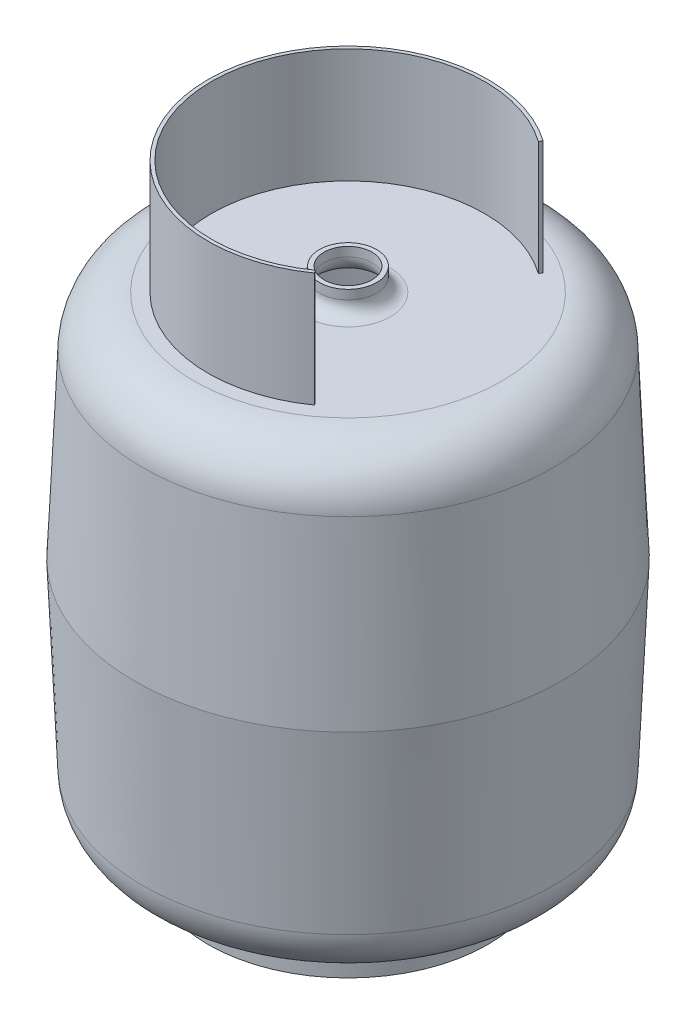
ISO-10303-21;
HEADER;
FILE_DESCRIPTION(('STEP AP214'),'2;1');
FILE_NAME('part.step','',(''),(''),'','','');
FILE_SCHEMA(('AUTOMOTIVE_DESIGN { 1 0 10303 214 1 1 1 1 }'));
ENDSEC;
DATA;
#1=APPLICATION_CONTEXT('core data for automotive mechanical design processes');
#2=APPLICATION_PROTOCOL_DEFINITION('international standard','automotive_design',2000,#1);
#3=PRODUCT_CONTEXT('',#1,'mechanical');
#4=PRODUCT('Part','Part','',(#3));
#5=PRODUCT_RELATED_PRODUCT_CATEGORY('part','',(#4));
#6=PRODUCT_DEFINITION_FORMATION('','',#4);
#7=PRODUCT_DEFINITION_CONTEXT('part definition',#1,'design');
#8=PRODUCT_DEFINITION('design','',#6,#7);
#9=PRODUCT_DEFINITION_SHAPE('','',#8);
#10=(LENGTH_UNIT() NAMED_UNIT(*) SI_UNIT(.MILLI.,.METRE.));
#11=(NAMED_UNIT(*) PLANE_ANGLE_UNIT() SI_UNIT($,.RADIAN.));
#12=(NAMED_UNIT(*) SI_UNIT($,.STERADIAN.) SOLID_ANGLE_UNIT());
#13=UNCERTAINTY_MEASURE_WITH_UNIT(LENGTH_MEASURE(1.E-05),#10,'distance_accuracy_value','');
#14=(GEOMETRIC_REPRESENTATION_CONTEXT(3) GLOBAL_UNCERTAINTY_ASSIGNED_CONTEXT((#13)) GLOBAL_UNIT_ASSIGNED_CONTEXT((#10,
#11,#12)) REPRESENTATION_CONTEXT('',''));
#15=CARTESIAN_POINT('',(0.,0.,0.));
#16=DIRECTION('',(0.,0.,1.));
#17=DIRECTION('',(1.,0.,0.));
#18=AXIS2_PLACEMENT_3D('',#15,#16,#17);
#19=CARTESIAN_POINT('',(134.421871598533,0.,0.));
#20=DIRECTION('',(0.,-1.,0.));
#21=DIRECTION('',(1.,0.,0.));
#22=AXIS2_PLACEMENT_3D('',#19,#20,#21);
#23=PLANE('',#22);
#24=CARTESIAN_POINT('',(0.,0.,0.));
#25=DIRECTION('',(0.,1.,0.));
#26=DIRECTION('',(-1.,0.,0.));
#27=AXIS2_PLACEMENT_3D('',#24,#25,#26);
#28=CIRCLE('',#27,134.421871598533);
#29=CARTESIAN_POINT('',(-134.421871598533,0.,0.));
#30=VERTEX_POINT('',#29);
#31=EDGE_CURVE('E137',#30,#30,#28,.T.);
#32=ORIENTED_EDGE('',*,*,#31,.T.);
#33=EDGE_LOOP('',(#32));
#34=FACE_BOUND('',#33,.T.);
#35=CARTESIAN_POINT('',(0.,0.,0.));
#36=DIRECTION('',(0.,1.,0.));
#37=DIRECTION('',(-1.,0.,0.));
#38=AXIS2_PLACEMENT_3D('',#35,#36,#37);
#39=CIRCLE('',#38,37.0000000000001);
#40=CARTESIAN_POINT('',(-37.0000000000001,0.,0.));
#41=VERTEX_POINT('',#40);
#42=EDGE_CURVE('E134',#41,#41,#39,.T.);
#43=ORIENTED_EDGE('',*,*,#42,.F.);
#44=EDGE_LOOP('',(#43));
#45=FACE_BOUND('',#44,.T.);
#46=CARTESIAN_POINT('',(0.,0.,0.));
#47=DIRECTION('',(0.,1.,0.));
#48=DIRECTION('',(-1.,0.,0.));
#49=AXIS2_PLACEMENT_3D('',#46,#47,#48);
#50=CIRCLE('',#49,122.421871598533);
#51=CARTESIAN_POINT('',(70.6195061274698,0.,-100.));
#52=VERTEX_POINT('',#51);
#53=CARTESIAN_POINT('',(70.6195061274698,0.,100.));
#54=VERTEX_POINT('',#53);
#55=EDGE_CURVE('E98',#52,#54,#50,.T.);
#56=ORIENTED_EDGE('',*,*,#55,.F.);
#57=DIRECTION('',(0.576853671695672,0.,-0.816847501955672));
#58=VECTOR('',#57,1.);
#59=CARTESIAN_POINT('',(68.8889451123828,0.,-97.549457494133));
#60=LINE('',#59,#58);
#61=CARTESIAN_POINT('',(68.8889451123828,0.,-97.549457494133));
#62=VERTEX_POINT('',#61);
#63=EDGE_CURVE('E95',#62,#52,#60,.T.);
#64=ORIENTED_EDGE('',*,*,#63,.F.);
#65=CARTESIAN_POINT('',(0.,0.,0.));
#66=DIRECTION('',(0.,-1.,0.));
#67=DIRECTION('',(-1.,0.,0.));
#68=AXIS2_PLACEMENT_3D('',#65,#66,#67);
#69=CIRCLE('',#68,119.421871598533);
#70=CARTESIAN_POINT('',(68.8889451123829,0.,97.5494574941329));
#71=VERTEX_POINT('',#70);
#72=EDGE_CURVE('E57',#71,#62,#69,.T.);
#73=ORIENTED_EDGE('',*,*,#72,.F.);
#74=DIRECTION('',(-0.576853671695667,0.,-0.816847501955676));
#75=VECTOR('',#74,1.);
#76=CARTESIAN_POINT('',(68.8889451123828,0.,97.549457494133));
#77=LINE('',#76,#75);
#78=EDGE_CURVE('E52',#54,#71,#77,.T.);
#79=ORIENTED_EDGE('',*,*,#78,.F.);
#80=EDGE_LOOP('',(#56,#64,#73,#79));
#81=FACE_BOUND('',#80,.T.);
#82=ADVANCED_FACE('F37',(#34,#45,#81),#23,.F.);
#83=CARTESIAN_POINT('',(25.,20.,0.));
#84=DIRECTION('',(0.,-1.,0.));
#85=DIRECTION('',(1.,0.,0.));
#86=AXIS2_PLACEMENT_3D('',#83,#84,#85);
#87=PLANE('',#86);
#88=CARTESIAN_POINT('',(0.,20.,0.));
#89=DIRECTION('',(0.,-1.,0.));
#90=DIRECTION('',(1.,0.,0.));
#91=AXIS2_PLACEMENT_3D('',#88,#89,#90);
#92=CIRCLE('',#91,21.);
#93=CARTESIAN_POINT('',(21.,20.,0.));
#94=VERTEX_POINT('',#93);
#95=EDGE_CURVE('E99',#94,#94,#92,.F.);
#96=ORIENTED_EDGE('',*,*,#95,.F.);
#97=EDGE_LOOP('',(#96));
#98=FACE_BOUND('',#97,.T.);
#99=CARTESIAN_POINT('',(0.,20.,0.));
#100=DIRECTION('',(0.,1.,0.));
#101=DIRECTION('',(-1.,0.,0.));
#102=AXIS2_PLACEMENT_3D('',#99,#100,#101);
#103=CIRCLE('',#102,25.);
#104=CARTESIAN_POINT('',(-25.,20.,0.));
#105=VERTEX_POINT('',#104);
#106=EDGE_CURVE('E111',#105,#105,#103,.T.);
#107=ORIENTED_EDGE('',*,*,#106,.T.);
#108=EDGE_LOOP('',(#107));
#109=FACE_BOUND('',#108,.T.);
#110=ADVANCED_FACE('F39',(#98,#109),#87,.F.);
#111=CARTESIAN_POINT('',(0.,-402.5,0.));
#112=DIRECTION('',(0.,1.,0.));
#113=DIRECTION('',(-1.,0.,0.));
#114=AXIS2_PLACEMENT_3D('',#111,#112,#113);
#115=PLANE('',#114);
#116=CARTESIAN_POINT('',(0.,-402.5,0.));
#117=DIRECTION('',(0.,1.,0.));
#118=DIRECTION('',(-1.,0.,0.));
#119=AXIS2_PLACEMENT_3D('',#116,#117,#118);
#120=CIRCLE('',#119,122.421871598533);
#121=CARTESIAN_POINT('',(-122.421871598533,-402.5,0.));
#122=VERTEX_POINT('',#121);
#123=EDGE_CURVE('E11',#122,#122,#120,.F.);
#124=ORIENTED_EDGE('',*,*,#123,.F.);
#125=EDGE_LOOP('',(#124));
#126=FACE_BOUND('',#125,.T.);
#127=CARTESIAN_POINT('',(0.,-402.5,0.));
#128=DIRECTION('',(0.,1.,0.));
#129=DIRECTION('',(-1.,0.,0.));
#130=AXIS2_PLACEMENT_3D('',#127,#128,#129);
#131=CIRCLE('',#130,134.421871598533);
#132=CARTESIAN_POINT('',(-134.421871598533,-402.5,0.));
#133=VERTEX_POINT('',#132);
#134=EDGE_CURVE('E45',#133,#133,#131,.T.);
#135=ORIENTED_EDGE('',*,*,#134,.F.);
#136=EDGE_LOOP('',(#135));
#137=FACE_BOUND('',#136,.T.);
#138=ADVANCED_FACE('F153',(#126,#137),#115,.F.);
#139=CARTESIAN_POINT('',(0.,-357.5,0.));
#140=DIRECTION('',(0.,1.,0.));
#141=DIRECTION('',(-1.,0.,0.));
#142=AXIS2_PLACEMENT_3D('',#139,#140,#141);
#143=TOROIDAL_SURFACE('',#142,134.421871598533,45.);
#144=CARTESIAN_POINT('',(0.,-359.46287243144,0.));
#145=DIRECTION('',(0.,1.,0.));
#146=DIRECTION('',(-1.,0.,0.));
#147=AXIS2_PLACEMENT_3D('',#144,#145,#146);
#148=CIRCLE('',#147,179.379041569717);
#149=CARTESIAN_POINT('',(-179.379041569717,-359.46287243144,0.));
#150=VERTEX_POINT('',#149);
#151=EDGE_CURVE('E146',#150,#150,#148,.T.);
#152=ORIENTED_EDGE('',*,*,#151,.F.);
#153=EDGE_LOOP('',(#152));
#154=FACE_BOUND('',#153,.T.);
#155=ORIENTED_EDGE('',*,*,#134,.T.);
#156=EDGE_LOOP('',(#155));
#157=FACE_BOUND('',#156,.T.);
#158=ADVANCED_FACE('F151',(#154,#157),#143,.T.);
#159=CARTESIAN_POINT('',(0.,-359.46287243144,0.));
#160=DIRECTION('',(0.,1.,0.));
#161=DIRECTION('',(-1.,0.,0.));
#162=AXIS2_PLACEMENT_3D('',#159,#160,#161);
#163=CONICAL_SURFACE('',#162,179.379041569717,0.0436332312998548);
#164=CARTESIAN_POINT('',(0.,-201.25,0.));
#165=DIRECTION('',(0.,1.,0.));
#166=DIRECTION('',(-1.,0.,0.));
#167=AXIS2_PLACEMENT_3D('',#164,#165,#166);
#168=CIRCLE('',#167,186.286764760337);
#169=CARTESIAN_POINT('',(-186.286764760337,-201.25,0.));
#170=VERTEX_POINT('',#169);
#171=EDGE_CURVE('E143',#170,#170,#168,.T.);
#172=ORIENTED_EDGE('',*,*,#171,.F.);
#173=EDGE_LOOP('',(#172));
#174=FACE_BOUND('',#173,.T.);
#175=ORIENTED_EDGE('',*,*,#151,.T.);
#176=EDGE_LOOP('',(#175));
#177=FACE_BOUND('',#176,.T.);
#178=ADVANCED_FACE('F161',(#174,#177),#163,.T.);
#179=CARTESIAN_POINT('',(0.,-201.25,0.));
#180=DIRECTION('',(0.,-1.,0.));
#181=DIRECTION('',(1.,0.,0.));
#182=AXIS2_PLACEMENT_3D('',#179,#180,#181);
#183=CONICAL_SURFACE('',#182,186.286764760337,0.0436332312998546);
#184=CARTESIAN_POINT('',(0.,-43.0371275685604,0.));
#185=DIRECTION('',(0.,1.,0.));
#186=DIRECTION('',(-1.,0.,0.));
#187=AXIS2_PLACEMENT_3D('',#184,#185,#186);
#188=CIRCLE('',#187,179.379041569717);
#189=CARTESIAN_POINT('',(-179.379041569717,-43.0371275685604,0.));
#190=VERTEX_POINT('',#189);
#191=EDGE_CURVE('E140',#190,#190,#188,.T.);
#192=ORIENTED_EDGE('',*,*,#191,.F.);
#193=EDGE_LOOP('',(#192));
#194=FACE_BOUND('',#193,.T.);
#195=ORIENTED_EDGE('',*,*,#171,.T.);
#196=EDGE_LOOP('',(#195));
#197=FACE_BOUND('',#196,.T.);
#198=ADVANCED_FACE('F182',(#194,#197),#183,.T.);
#199=CARTESIAN_POINT('',(0.,-45.,0.));
#200=DIRECTION('',(0.,1.,0.));
#201=DIRECTION('',(-1.,0.,0.));
#202=AXIS2_PLACEMENT_3D('',#199,#200,#201);
#203=TOROIDAL_SURFACE('',#202,134.421871598533,45.);
#204=ORIENTED_EDGE('',*,*,#31,.F.);
#205=EDGE_LOOP('',(#204));
#206=FACE_BOUND('',#205,.T.);
#207=ORIENTED_EDGE('',*,*,#191,.T.);
#208=EDGE_LOOP('',(#207));
#209=FACE_BOUND('',#208,.T.);
#210=ADVANCED_FACE('F179',(#206,#209),#203,.T.);
#211=CARTESIAN_POINT('',(0.,12.,0.));
#212=DIRECTION('',(0.,1.,0.));
#213=DIRECTION('',(-1.,0.,0.));
#214=AXIS2_PLACEMENT_3D('',#211,#212,#213);
#215=TOROIDAL_SURFACE('',#214,37.,12.);
#216=CARTESIAN_POINT('',(0.,12.,0.));
#217=DIRECTION('',(0.,1.,0.));
#218=DIRECTION('',(-1.,0.,0.));
#219=AXIS2_PLACEMENT_3D('',#216,#217,#218);
#220=CIRCLE('',#219,25.);
#221=CARTESIAN_POINT('',(-25.,12.,0.));
#222=VERTEX_POINT('',#221);
#223=EDGE_CURVE('E131',#222,#222,#220,.T.);
#224=ORIENTED_EDGE('',*,*,#223,.F.);
#225=EDGE_LOOP('',(#224));
#226=FACE_BOUND('',#225,.T.);
#227=ORIENTED_EDGE('',*,*,#42,.T.);
#228=EDGE_LOOP('',(#227));
#229=FACE_BOUND('',#228,.T.);
#230=ADVANCED_FACE('F177',(#226,#229),#215,.F.);
#231=CARTESIAN_POINT('',(0.,0.,0.));
#232=DIRECTION('',(0.,1.,0.));
#233=DIRECTION('',(-1.,0.,0.));
#234=AXIS2_PLACEMENT_3D('',#231,#232,#233);
#235=CYLINDRICAL_SURFACE('',#234,25.);
#236=ORIENTED_EDGE('',*,*,#106,.F.);
#237=EDGE_LOOP('',(#236));
#238=FACE_BOUND('',#237,.T.);
#239=ORIENTED_EDGE('',*,*,#223,.T.);
#240=EDGE_LOOP('',(#239));
#241=FACE_BOUND('',#240,.T.);
#242=ADVANCED_FACE('F211',(#238,#241),#235,.T.);
#243=CARTESIAN_POINT('',(0.,-398.5,0.));
#244=DIRECTION('',(0.,1.,0.));
#245=DIRECTION('',(-1.,0.,0.));
#246=AXIS2_PLACEMENT_3D('',#243,#244,#245);
#247=PLANE('',#246);
#248=CARTESIAN_POINT('',(0.,-398.5,0.));
#249=DIRECTION('',(0.,1.,0.));
#250=DIRECTION('',(-1.,0.,0.));
#251=AXIS2_PLACEMENT_3D('',#248,#249,#250);
#252=CIRCLE('',#251,134.421871598533);
#253=CARTESIAN_POINT('',(-134.421871598533,-398.5,0.));
#254=VERTEX_POINT('',#253);
#255=EDGE_CURVE('E108',#254,#254,#252,.T.);
#256=ORIENTED_EDGE('',*,*,#255,.T.);
#257=EDGE_LOOP('',(#256));
#258=FACE_BOUND('',#257,.T.);
#259=ADVANCED_FACE('F218',(#258),#247,.T.);
#260=CARTESIAN_POINT('',(0.,-357.5,0.));
#261=DIRECTION('',(0.,1.,0.));
#262=DIRECTION('',(-1.,0.,0.));
#263=AXIS2_PLACEMENT_3D('',#260,#261,#262);
#264=TOROIDAL_SURFACE('',#263,134.421871598533,41.);
#265=CARTESIAN_POINT('',(0.,-359.288394881978,0.));
#266=DIRECTION('',(0.,1.,0.));
#267=DIRECTION('',(-1.,0.,0.));
#268=AXIS2_PLACEMENT_3D('',#265,#266,#267);
#269=CIRCLE('',#268,175.38284868339);
#270=CARTESIAN_POINT('',(-175.38284868339,-359.288394881978,0.));
#271=VERTEX_POINT('',#270);
#272=EDGE_CURVE('E112',#271,#271,#269,.T.);
#273=ORIENTED_EDGE('',*,*,#272,.T.);
#274=EDGE_LOOP('',(#273));
#275=FACE_BOUND('',#274,.T.);
#276=ORIENTED_EDGE('',*,*,#255,.F.);
#277=EDGE_LOOP('',(#276));
#278=FACE_BOUND('',#277,.T.);
#279=ADVANCED_FACE('F226',(#275,#278),#264,.F.);
#280=CARTESIAN_POINT('',(0.,-359.288394881978,0.));
#281=DIRECTION('',(0.,1.,0.));
#282=DIRECTION('',(-1.,0.,0.));
#283=AXIS2_PLACEMENT_3D('',#280,#281,#282);
#284=CONICAL_SURFACE('',#283,175.38284868339,0.0436332312998548);
#285=CARTESIAN_POINT('',(0.,-201.25,0.));
#286=DIRECTION('',(0.,1.,0.));
#287=DIRECTION('',(-1.,0.,0.));
#288=AXIS2_PLACEMENT_3D('',#285,#286,#287);
#289=CIRCLE('',#288,182.282954019684);
#290=CARTESIAN_POINT('',(-182.282954019684,-201.25,0.));
#291=VERTEX_POINT('',#290);
#292=EDGE_CURVE('E115',#291,#291,#289,.T.);
#293=ORIENTED_EDGE('',*,*,#292,.T.);
#294=EDGE_LOOP('',(#293));
#295=FACE_BOUND('',#294,.T.);
#296=ORIENTED_EDGE('',*,*,#272,.F.);
#297=EDGE_LOOP('',(#296));
#298=FACE_BOUND('',#297,.T.);
#299=ADVANCED_FACE('F234',(#295,#298),#284,.F.);
#300=CARTESIAN_POINT('',(0.,-201.424477549461,0.));
#301=DIRECTION('',(0.,-1.,0.));
#302=DIRECTION('',(1.,0.,0.));
#303=AXIS2_PLACEMENT_3D('',#300,#301,#302);
#304=CONICAL_SURFACE('',#303,182.29057187401,0.0436332312998546);
#305=CARTESIAN_POINT('',(0.,-43.2116051180217,0.));
#306=DIRECTION('',(0.,1.,0.));
#307=DIRECTION('',(-1.,0.,0.));
#308=AXIS2_PLACEMENT_3D('',#305,#306,#307);
#309=CIRCLE('',#308,175.38284868339);
#310=CARTESIAN_POINT('',(-175.38284868339,-43.2116051180217,0.));
#311=VERTEX_POINT('',#310);
#312=EDGE_CURVE('E118',#311,#311,#309,.T.);
#313=ORIENTED_EDGE('',*,*,#312,.T.);
#314=EDGE_LOOP('',(#313));
#315=FACE_BOUND('',#314,.T.);
#316=ORIENTED_EDGE('',*,*,#292,.F.);
#317=EDGE_LOOP('',(#316));
#318=FACE_BOUND('',#317,.T.);
#319=ADVANCED_FACE('F242',(#315,#318),#304,.F.);
#320=CARTESIAN_POINT('',(0.,-45.,0.));
#321=DIRECTION('',(0.,1.,0.));
#322=DIRECTION('',(-1.,0.,0.));
#323=AXIS2_PLACEMENT_3D('',#320,#321,#322);
#324=TOROIDAL_SURFACE('',#323,134.421871598533,41.);
#325=CARTESIAN_POINT('',(0.,-4.00000000000002,0.));
#326=DIRECTION('',(0.,1.,0.));
#327=DIRECTION('',(-1.,0.,0.));
#328=AXIS2_PLACEMENT_3D('',#325,#326,#327);
#329=CIRCLE('',#328,134.421871598533);
#330=CARTESIAN_POINT('',(-134.421871598533,-4.00000000000003,0.));
#331=VERTEX_POINT('',#330);
#332=EDGE_CURVE('E121',#331,#331,#329,.T.);
#333=ORIENTED_EDGE('',*,*,#332,.T.);
#334=EDGE_LOOP('',(#333));
#335=FACE_BOUND('',#334,.T.);
#336=ORIENTED_EDGE('',*,*,#312,.F.);
#337=EDGE_LOOP('',(#336));
#338=FACE_BOUND('',#337,.T.);
#339=ADVANCED_FACE('F250',(#335,#338),#324,.F.);
#340=CARTESIAN_POINT('',(134.421871598533,-4.00000000000001,0.));
#341=DIRECTION('',(0.,-1.,0.));
#342=DIRECTION('',(1.,0.,0.));
#343=AXIS2_PLACEMENT_3D('',#340,#341,#342);
#344=PLANE('',#343);
#345=CARTESIAN_POINT('',(0.,-4.00000000000002,0.));
#346=DIRECTION('',(0.,1.,0.));
#347=DIRECTION('',(-1.,0.,0.));
#348=AXIS2_PLACEMENT_3D('',#345,#346,#347);
#349=CIRCLE('',#348,37.0000000000001);
#350=CARTESIAN_POINT('',(-37.0000000000001,-4.00000000000003,0.));
#351=VERTEX_POINT('',#350);
#352=EDGE_CURVE('E124',#351,#351,#349,.T.);
#353=ORIENTED_EDGE('',*,*,#352,.T.);
#354=EDGE_LOOP('',(#353));
#355=FACE_BOUND('',#354,.T.);
#356=ORIENTED_EDGE('',*,*,#332,.F.);
#357=EDGE_LOOP('',(#356));
#358=FACE_BOUND('',#357,.T.);
#359=ADVANCED_FACE('F258',(#355,#358),#344,.T.);
#360=CARTESIAN_POINT('',(0.,12.,0.));
#361=DIRECTION('',(0.,1.,0.));
#362=DIRECTION('',(-1.,0.,0.));
#363=AXIS2_PLACEMENT_3D('',#360,#361,#362);
#364=TOROIDAL_SURFACE('',#363,37.,16.);
#365=CARTESIAN_POINT('',(0.,12.,0.));
#366=DIRECTION('',(0.,1.,0.));
#367=DIRECTION('',(-1.,0.,0.));
#368=AXIS2_PLACEMENT_3D('',#365,#366,#367);
#369=CIRCLE('',#368,21.);
#370=CARTESIAN_POINT('',(-21.,12.,0.));
#371=VERTEX_POINT('',#370);
#372=EDGE_CURVE('E102',#371,#371,#369,.T.);
#373=ORIENTED_EDGE('',*,*,#372,.T.);
#374=EDGE_LOOP('',(#373));
#375=FACE_BOUND('',#374,.T.);
#376=ORIENTED_EDGE('',*,*,#352,.F.);
#377=EDGE_LOOP('',(#376));
#378=FACE_BOUND('',#377,.T.);
#379=ADVANCED_FACE('F266',(#375,#378),#364,.T.);
#380=CARTESIAN_POINT('',(0.,0.,0.));
#381=DIRECTION('',(0.,1.,0.));
#382=DIRECTION('',(-1.,0.,0.));
#383=AXIS2_PLACEMENT_3D('',#380,#381,#382);
#384=CYLINDRICAL_SURFACE('',#383,21.);
#385=ORIENTED_EDGE('',*,*,#95,.T.);
#386=EDGE_LOOP('',(#385));
#387=FACE_BOUND('',#386,.T.);
#388=ORIENTED_EDGE('',*,*,#372,.F.);
#389=EDGE_LOOP('',(#388));
#390=FACE_BOUND('',#389,.T.);
#391=ADVANCED_FACE('F274',(#387,#390),#384,.F.);
#392=CARTESIAN_POINT('',(0.,100.,0.));
#393=DIRECTION('',(0.,-1.,0.));
#394=DIRECTION('',(1.,0.,0.));
#395=AXIS2_PLACEMENT_3D('',#392,#393,#394);
#396=CYLINDRICAL_SURFACE('',#395,122.421871598533);
#397=ORIENTED_EDGE('',*,*,#55,.T.);
#398=DIRECTION('',(0.,-1.,0.));
#399=VECTOR('',#398,1.);
#400=CARTESIAN_POINT('',(70.6195061274698,100.,100.));
#401=LINE('',#400,#399);
#402=CARTESIAN_POINT('',(70.6195061274698,100.,100.));
#403=VERTEX_POINT('',#402);
#404=EDGE_CURVE('E79',#403,#54,#401,.T.);
#405=ORIENTED_EDGE('',*,*,#404,.F.);
#406=CARTESIAN_POINT('',(0.,100.,0.));
#407=DIRECTION('',(0.,1.,0.));
#408=DIRECTION('',(-1.,0.,0.));
#409=AXIS2_PLACEMENT_3D('',#406,#407,#408);
#410=CIRCLE('',#409,122.421871598533);
#411=CARTESIAN_POINT('',(70.6195061274698,100.,-100.));
#412=VERTEX_POINT('',#411);
#413=EDGE_CURVE('E86',#412,#403,#410,.T.);
#414=ORIENTED_EDGE('',*,*,#413,.F.);
#415=DIRECTION('',(0.,-1.,0.));
#416=VECTOR('',#415,1.);
#417=CARTESIAN_POINT('',(70.6195061274698,100.,-100.));
#418=LINE('',#417,#416);
#419=EDGE_CURVE('E422',#412,#52,#418,.T.);
#420=ORIENTED_EDGE('',*,*,#419,.T.);
#421=EDGE_LOOP('',(#397,#405,#414,#420));
#422=FACE_BOUND('',#421,.T.);
#423=ADVANCED_FACE('F97',(#422),#396,.T.);
#424=CARTESIAN_POINT('',(68.8889451123828,100.,97.549457494133));
#425=DIRECTION('',(-0.816847501955676,0.,0.576853671695667));
#426=DIRECTION('',(0.576853671695667,0.,0.816847501955676));
#427=AXIS2_PLACEMENT_3D('',#424,#425,#426);
#428=PLANE('',#427);
#429=ORIENTED_EDGE('',*,*,#78,.T.);
#430=DIRECTION('',(0.,-1.,0.));
#431=VECTOR('',#430,1.);
#432=CARTESIAN_POINT('',(68.8889451123828,100.,97.5494574941329));
#433=LINE('',#432,#431);
#434=CARTESIAN_POINT('',(68.8889451123828,100.,97.5494574941329));
#435=VERTEX_POINT('',#434);
#436=EDGE_CURVE('E82',#435,#71,#433,.T.);
#437=ORIENTED_EDGE('',*,*,#436,.F.);
#438=DIRECTION('',(-0.576853671695667,0.,-0.816847501955676));
#439=VECTOR('',#438,1.);
#440=CARTESIAN_POINT('',(68.8889451123828,100.,97.549457494133));
#441=LINE('',#440,#439);
#442=EDGE_CURVE('E75',#403,#435,#441,.T.);
#443=ORIENTED_EDGE('',*,*,#442,.F.);
#444=ORIENTED_EDGE('',*,*,#404,.T.);
#445=EDGE_LOOP('',(#429,#437,#443,#444));
#446=FACE_BOUND('',#445,.T.);
#447=ADVANCED_FACE('F77',(#446),#428,.F.);
#448=CARTESIAN_POINT('',(0.,100.,0.));
#449=DIRECTION('',(0.,-1.,0.));
#450=DIRECTION('',(1.,0.,0.));
#451=AXIS2_PLACEMENT_3D('',#448,#449,#450);
#452=CYLINDRICAL_SURFACE('',#451,119.421871598533);
#453=ORIENTED_EDGE('',*,*,#72,.T.);
#454=DIRECTION('',(0.,-1.,0.));
#455=VECTOR('',#454,1.);
#456=CARTESIAN_POINT('',(68.8889451123827,100.,-97.549457494133));
#457=LINE('',#456,#455);
#458=CARTESIAN_POINT('',(68.8889451123827,100.,-97.549457494133));
#459=VERTEX_POINT('',#458);
#460=EDGE_CURVE('E104',#459,#62,#457,.T.);
#461=ORIENTED_EDGE('',*,*,#460,.F.);
#462=CARTESIAN_POINT('',(0.,100.,0.));
#463=DIRECTION('',(0.,-1.,0.));
#464=DIRECTION('',(-1.,0.,0.));
#465=AXIS2_PLACEMENT_3D('',#462,#463,#464);
#466=CIRCLE('',#465,119.421871598533);
#467=EDGE_CURVE('E85',#435,#459,#466,.T.);
#468=ORIENTED_EDGE('',*,*,#467,.F.);
#469=ORIENTED_EDGE('',*,*,#436,.T.);
#470=EDGE_LOOP('',(#453,#461,#468,#469));
#471=FACE_BOUND('',#470,.T.);
#472=ADVANCED_FACE('F295',(#471),#452,.F.);
#473=CARTESIAN_POINT('',(68.8889451123827,100.,-97.549457494133));
#474=DIRECTION('',(-0.816847501955672,0.,-0.576853671695672));
#475=DIRECTION('',(-0.576853671695672,0.,0.816847501955672));
#476=AXIS2_PLACEMENT_3D('',#473,#474,#475);
#477=PLANE('',#476);
#478=ORIENTED_EDGE('',*,*,#63,.T.);
#479=ORIENTED_EDGE('',*,*,#419,.F.);
#480=DIRECTION('',(0.576853671695672,0.,-0.816847501955672));
#481=VECTOR('',#480,1.);
#482=CARTESIAN_POINT('',(68.8889451123827,100.,-97.549457494133));
#483=LINE('',#482,#481);
#484=EDGE_CURVE('E91',#459,#412,#483,.T.);
#485=ORIENTED_EDGE('',*,*,#484,.F.);
#486=ORIENTED_EDGE('',*,*,#460,.T.);
#487=EDGE_LOOP('',(#478,#479,#485,#486));
#488=FACE_BOUND('',#487,.T.);
#489=ADVANCED_FACE('F302',(#488),#477,.F.);
#490=CARTESIAN_POINT('',(0.,100.,0.));
#491=DIRECTION('',(0.,1.,0.));
#492=DIRECTION('',(-1.,0.,0.));
#493=AXIS2_PLACEMENT_3D('',#490,#491,#492);
#494=PLANE('',#493);
#495=ORIENTED_EDGE('',*,*,#413,.T.);
#496=ORIENTED_EDGE('',*,*,#442,.T.);
#497=ORIENTED_EDGE('',*,*,#467,.T.);
#498=ORIENTED_EDGE('',*,*,#484,.T.);
#499=EDGE_LOOP('',(#495,#496,#497,#498));
#500=FACE_BOUND('',#499,.T.);
#501=ADVANCED_FACE('F89',(#500),#494,.T.);
#502=CARTESIAN_POINT('',(0.,-432.5,0.));
#503=DIRECTION('',(0.,-1.,0.));
#504=DIRECTION('',(1.,0.,0.));
#505=AXIS2_PLACEMENT_3D('',#502,#503,#504);
#506=PLANE('',#505);
#507=CARTESIAN_POINT('',(0.,-432.5,0.));
#508=DIRECTION('',(0.,-1.,0.));
#509=DIRECTION('',(1.,0.,0.));
#510=AXIS2_PLACEMENT_3D('',#507,#508,#509);
#511=CIRCLE('',#510,122.421871598533);
#512=CARTESIAN_POINT('',(122.421871598533,-432.5,0.));
#513=VERTEX_POINT('',#512);
#514=EDGE_CURVE('E415',#513,#513,#511,.T.);
#515=ORIENTED_EDGE('',*,*,#514,.T.);
#516=EDGE_LOOP('',(#515));
#517=FACE_BOUND('',#516,.T.);
#518=CARTESIAN_POINT('',(0.,-432.5,0.));
#519=DIRECTION('',(0.,-1.,0.));
#520=DIRECTION('',(1.,0.,0.));
#521=AXIS2_PLACEMENT_3D('',#518,#519,#520);
#522=CIRCLE('',#521,119.421871598533);
#523=CARTESIAN_POINT('',(119.421871598533,-432.5,0.));
#524=VERTEX_POINT('',#523);
#525=EDGE_CURVE('E410',#524,#524,#522,.T.);
#526=ORIENTED_EDGE('',*,*,#525,.F.);
#527=EDGE_LOOP('',(#526));
#528=FACE_BOUND('',#527,.T.);
#529=ADVANCED_FACE('F317',(#517,#528),#506,.T.);
#530=CARTESIAN_POINT('',(0.,-432.5,0.));
#531=DIRECTION('',(0.,1.,0.));
#532=DIRECTION('',(-1.,0.,0.));
#533=AXIS2_PLACEMENT_3D('',#530,#531,#532);
#534=CYLINDRICAL_SURFACE('',#533,122.421871598533);
#535=ORIENTED_EDGE('',*,*,#514,.F.);
#536=EDGE_LOOP('',(#535));
#537=FACE_BOUND('',#536,.T.);
#538=ORIENTED_EDGE('',*,*,#123,.T.);
#539=EDGE_LOOP('',(#538));
#540=FACE_BOUND('',#539,.T.);
#541=ADVANCED_FACE('F324',(#537,#540),#534,.T.);
#542=CARTESIAN_POINT('',(0.,-432.5,0.));
#543=DIRECTION('',(0.,1.,0.));
#544=DIRECTION('',(-1.,0.,0.));
#545=AXIS2_PLACEMENT_3D('',#542,#543,#544);
#546=CYLINDRICAL_SURFACE('',#545,119.421871598533);
#547=ORIENTED_EDGE('',*,*,#525,.T.);
#548=EDGE_LOOP('',(#547));
#549=FACE_BOUND('',#548,.T.);
#550=CARTESIAN_POINT('',(0.,-402.5,0.));
#551=DIRECTION('',(0.,-1.,0.));
#552=DIRECTION('',(1.,0.,0.));
#553=AXIS2_PLACEMENT_3D('',#550,#551,#552);
#554=CIRCLE('',#553,119.421871598533);
#555=CARTESIAN_POINT('',(119.421871598533,-402.5,0.));
#556=VERTEX_POINT('',#555);
#557=EDGE_CURVE('E413',#556,#556,#554,.T.);
#558=ORIENTED_EDGE('',*,*,#557,.F.);
#559=EDGE_LOOP('',(#558));
#560=FACE_BOUND('',#559,.T.);
#561=ADVANCED_FACE('F167',(#549,#560),#546,.F.);
#562=ORIENTED_EDGE('',*,*,#557,.T.);
#563=EDGE_LOOP('',(#562));
#564=FACE_BOUND('',#563,.T.);
#565=ADVANCED_FACE('F156',(#564),#115,.F.);
#566=CLOSED_SHELL('',(#82,#110,#138,#158,#178,#198,#210,#230,#242,#259,#279,#299,#319,#339,#359,
#379,#391,#423,#447,#472,#489,#501,#529,#541,#561,#565));
#567=MANIFOLD_SOLID_BREP('B2',#566);
#568=ADVANCED_BREP_SHAPE_REPRESENTATION('',(#18,#567),#14);
#569=SHAPE_DEFINITION_REPRESENTATION(#9,#568);
ENDSEC;
END-ISO-10303-21;
